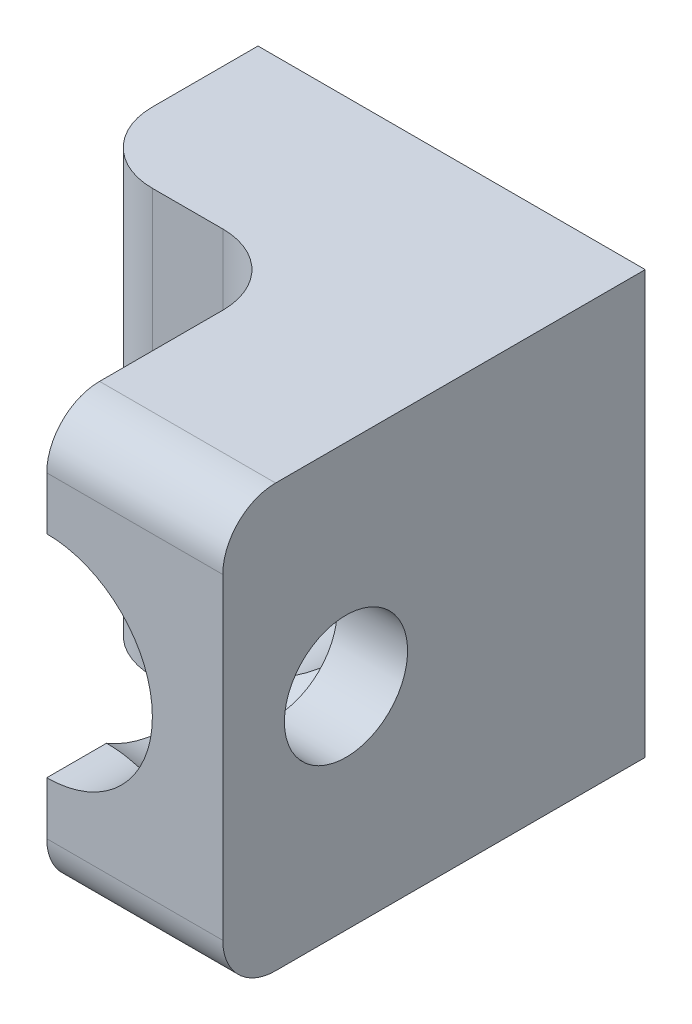
ISO-10303-21;
HEADER;
FILE_DESCRIPTION(('STEP AP214'),'2;1');
FILE_NAME('part.step','',(''),(''),'','','');
FILE_SCHEMA(('AUTOMOTIVE_DESIGN { 1 0 10303 214 1 1 1 1 }'));
ENDSEC;
DATA;
#1=APPLICATION_CONTEXT('core data for automotive mechanical design processes');
#2=APPLICATION_PROTOCOL_DEFINITION('international standard','automotive_design',2000,#1);
#3=PRODUCT_CONTEXT('',#1,'mechanical');
#4=PRODUCT('Part','Part','',(#3));
#5=PRODUCT_RELATED_PRODUCT_CATEGORY('part','',(#4));
#6=PRODUCT_DEFINITION_FORMATION('','',#4);
#7=PRODUCT_DEFINITION_CONTEXT('part definition',#1,'design');
#8=PRODUCT_DEFINITION('design','',#6,#7);
#9=PRODUCT_DEFINITION_SHAPE('','',#8);
#10=(LENGTH_UNIT() NAMED_UNIT(*) SI_UNIT(.MILLI.,.METRE.));
#11=(NAMED_UNIT(*) PLANE_ANGLE_UNIT() SI_UNIT($,.RADIAN.));
#12=(NAMED_UNIT(*) SI_UNIT($,.STERADIAN.) SOLID_ANGLE_UNIT());
#13=UNCERTAINTY_MEASURE_WITH_UNIT(LENGTH_MEASURE(1.E-05),#10,'distance_accuracy_value','');
#14=(GEOMETRIC_REPRESENTATION_CONTEXT(3) GLOBAL_UNCERTAINTY_ASSIGNED_CONTEXT((#13)) GLOBAL_UNIT_ASSIGNED_CONTEXT((#10,
#11,#12)) REPRESENTATION_CONTEXT('',''));
#15=CARTESIAN_POINT('',(0.,0.,0.));
#16=DIRECTION('',(0.,0.,1.));
#17=DIRECTION('',(1.,0.,0.));
#18=AXIS2_PLACEMENT_3D('',#15,#16,#17);
#19=CARTESIAN_POINT('',(0.,0.,5.));
#20=DIRECTION('',(0.,0.,-1.));
#21=DIRECTION('',(-1.,0.,0.));
#22=AXIS2_PLACEMENT_3D('',#19,#20,#21);
#23=CYLINDRICAL_SURFACE('',#22,3.);
#24=CARTESIAN_POINT('',(3.,0.,12.));
#25=CARTESIAN_POINT('',(3.00001633775411,0.0710041835583697,12.0000170022289));
#26=CARTESIAN_POINT('',(2.99747976128876,0.141995694320472,11.9978398644975));
#27=CARTESIAN_POINT('',(2.98742711328492,0.283315653690185,11.9892274963687));
#28=CARTESIAN_POINT('',(2.97991461773743,0.353644541711693,11.982795323896));
#29=CARTESIAN_POINT('',(2.96011400626676,0.492558840544803,11.9658692983622));
#30=CARTESIAN_POINT('',(2.94786376785825,0.561153594120886,11.9554076628753));
#31=CARTESIAN_POINT('',(2.91881454099886,0.696656257307692,11.9306590213712));
#32=CARTESIAN_POINT('',(2.90201496040398,0.763563946089351,11.9163715173803));
#33=CARTESIAN_POINT('',(2.84527703800831,0.960740635150711,11.8682623547826));
#34=CARTESIAN_POINT('',(2.79892714871843,1.08795293552987,11.8291314879743));
#35=CARTESIAN_POINT('',(2.69153719144,1.33171680913301,11.7393690034355));
#36=CARTESIAN_POINT('',(2.63046789263742,1.448246524441,11.6887145126834));
#37=CARTESIAN_POINT('',(2.47045184466388,1.7113429642546,11.5578157443865));
#38=CARTESIAN_POINT('',(2.36591652066644,1.85259055558324,11.4736276809207));
#39=CARTESIAN_POINT('',(2.19499021751385,2.04682837404312,11.3401985238869));
#40=CARTESIAN_POINT('',(2.13555034311233,2.10872346326868,11.2944489838427));
#41=CARTESIAN_POINT('',(2.01225951085483,2.22667426047481,11.2013973194638));
#42=CARTESIAN_POINT('',(1.94841014785883,2.28273206152663,11.1540957596919));
#43=CARTESIAN_POINT('',(1.81518541502242,2.39009915702108,11.0578760942901));
#44=CARTESIAN_POINT('',(1.74572457414769,2.4412898984597,11.0089446253118));
#45=CARTESIAN_POINT('',(1.60244675269493,2.53764058581353,10.9114467445743));
#46=CARTESIAN_POINT('',(1.52862834947803,2.58279854629449,10.8628804579376));
#47=CARTESIAN_POINT('',(1.37661843052713,2.66691965115512,10.7675038527581));
#48=CARTESIAN_POINT('',(1.29843302030285,2.70589116555522,10.7206912282802));
#49=CARTESIAN_POINT('',(1.13734906339909,2.77744410133662,10.6305194486357));
#50=CARTESIAN_POINT('',(1.05445439394846,2.81003068396212,10.5871575210868));
#51=CARTESIAN_POINT('',(0.874598638987153,2.87141676741914,10.5019964034133));
#52=CARTESIAN_POINT('',(0.777071653259997,2.89946856779334,10.4608301304701));
#53=CARTESIAN_POINT('',(0.57601560305952,2.94597031964501,10.390253355229));
#54=CARTESIAN_POINT('',(0.472522678361376,2.96447246663734,10.3607791569805));
#55=CARTESIAN_POINT('',(0.306834908970952,2.98487635994208,10.3277637064125));
#56=CARTESIAN_POINT('',(0.246228042378373,2.99049788569714,10.3185190733684));
#57=CARTESIAN_POINT('',(0.123778706724893,2.99808254680575,10.3059676393636));
#58=CARTESIAN_POINT('',(0.0619307088552813,3.00002117254105,10.3027006245848));
#59=CARTESIAN_POINT('',(0.,3.,10.302775637732));
#60=B_SPLINE_CURVE_WITH_KNOTS('',3,(#24,#25,#26,#27,#28,#29,#30,#31,#32,#33,#34,#35,#36,#37,#38,
#39,#40,#41,#42,#43,#44,#45,#46,#47,#48,#49,#50,#51,#52,#53,#54,#55,#56,#57,#58,#59),
.UNSPECIFIED.,.F.,.F.,(4,2,2,2,2,2,2,2,2,2,2,2,2,2,2,2,2,4),(0.,0.21291321799361,
0.425673589681885,0.636767011782253,0.84788792309536,1.26865257537392,1.69025979710682,
2.27140064229933,2.56294132748464,2.85437711258026,3.15168989736915,3.44910029027378,
3.7461048044053,4.04286823610708,4.37053402174074,4.69638939754148,4.88070391336868,
5.06624079907364),.UNSPECIFIED.);
#61=CARTESIAN_POINT('',(3.,0.,12.));
#62=VERTEX_POINT('',#61);
#63=CARTESIAN_POINT('',(0.,3.,10.302775637732));
#64=VERTEX_POINT('',#63);
#65=EDGE_CURVE('E286',#62,#64,#60,.T.);
#66=ORIENTED_EDGE('',*,*,#65,.F.);
#67=CARTESIAN_POINT('',(0.,0.,12.));
#68=DIRECTION('',(0.,0.,-1.));
#69=DIRECTION('',(1.,0.,0.));
#70=AXIS2_PLACEMENT_3D('',#67,#68,#69);
#71=CIRCLE('',#70,3.);
#72=CARTESIAN_POINT('',(0.,3.,12.));
#73=VERTEX_POINT('',#72);
#74=EDGE_CURVE('E340',#73,#62,#71,.T.);
#75=ORIENTED_EDGE('',*,*,#74,.F.);
#76=DIRECTION('',(0.,0.,-1.));
#77=VECTOR('',#76,1.);
#78=CARTESIAN_POINT('',(0.,3.,12.));
#79=LINE('',#78,#77);
#80=EDGE_CURVE('E342',#73,#64,#79,.T.);
#81=ORIENTED_EDGE('',*,*,#80,.T.);
#82=EDGE_LOOP('',(#66,#75,#81));
#83=FACE_BOUND('',#82,.T.);
#84=ADVANCED_FACE('F36',(#83),#23,.F.);
#85=CARTESIAN_POINT('',(0.,-3.,10.302775637732));
#86=CARTESIAN_POINT('',(0.0509782574028776,-3.00001221469676,10.3027351255346));
#87=CARTESIAN_POINT('',(0.101929503496293,-2.99870116871572,10.3049368888778));
#88=CARTESIAN_POINT('',(0.203244722626997,-2.99353287116003,10.3135063025252));
#89=CARTESIAN_POINT('',(0.253609717217957,-2.9896810615236,10.3198650489301));
#90=CARTESIAN_POINT('',(0.352654909751894,-2.97961065684442,10.3363018828792));
#91=CARTESIAN_POINT('',(0.401349148380551,-2.97343026409919,10.3463198607921));
#92=CARTESIAN_POINT('',(0.497622474635582,-2.9588416466632,10.3696120547244));
#93=CARTESIAN_POINT('',(0.545200866775569,-2.95043207072965,10.3828882453804));
#94=CARTESIAN_POINT('',(0.726157814320993,-2.9139975074394,10.4393441007995));
#95=CARTESIAN_POINT('',(0.85506933756873,-2.87851173420836,10.4923306497304));
#96=CARTESIAN_POINT('',(1.04056910301911,-2.81452738275439,10.5808183598738));
#97=CARTESIAN_POINT('',(1.10137237396703,-2.79126425540245,10.611992739488));
#98=CARTESIAN_POINT('',(1.22040935784467,-2.74130563551504,10.6764417547228));
#99=CARTESIAN_POINT('',(1.27864396134847,-2.71461134535184,10.7097156525458));
#100=CARTESIAN_POINT('',(1.4222275235347,-2.6432232929282,10.7951850848155));
#101=CARTESIAN_POINT('',(1.50598538452611,-2.59637160280961,10.8482488825418));
#102=CARTESIAN_POINT('',(1.66820661712296,-2.49523964907324,10.9554470787355));
#103=CARTESIAN_POINT('',(1.74666740599088,-2.44095580019921,11.0095819830539));
#104=CARTESIAN_POINT('',(1.89808768116394,-2.32514957383405,11.1172337547621));
#105=CARTESIAN_POINT('',(1.97106129394351,-2.2636469062519,11.1707518862159));
#106=CARTESIAN_POINT('',(2.11148804783259,-2.13326006036693,11.276009457029));
#107=CARTESIAN_POINT('',(2.17894066420241,-2.06437518185999,11.3277487270472));
#108=CARTESIAN_POINT('',(2.34361912431401,-1.87889158232084,11.4561109770901));
#109=CARTESIAN_POINT('',(2.43664287715046,-1.75699755578858,11.5306441279723));
#110=CARTESIAN_POINT('',(2.60520555605571,-1.49565744692714,11.6677617616793));
#111=CARTESIAN_POINT('',(2.68076628257079,-1.35623358804076,11.7303611250795));
#112=CARTESIAN_POINT('',(2.79874727634433,-1.08830536541844,11.8289852260442));
#113=CARTESIAN_POINT('',(2.84468813430475,-0.962376032465356,11.8677675367341));
#114=CARTESIAN_POINT('',(2.91975024600053,-0.702331299892864,11.9314051965436));
#115=CARTESIAN_POINT('',(2.94890505699959,-0.568232829315052,11.9562883287469));
#116=CARTESIAN_POINT('',(2.97909960785513,-0.360774253811003,11.9820983229808));
#117=CARTESIAN_POINT('',(2.9869169852851,-0.289032304751515,11.9887909130479));
#118=CARTESIAN_POINT('',(2.99737282014752,-0.144874980211614,11.9977478922567));
#119=CARTESIAN_POINT('',(3.00000954791344,-0.0724593879264361,12.0000108024577));
#120=CARTESIAN_POINT('',(3.,0.,12.));
#121=B_SPLINE_CURVE_WITH_KNOTS('',3,(#85,#86,#87,#88,#89,#90,#91,#92,#93,#94,#95,#96,#97,#98,
#99,#100,#101,#102,#103,#104,#105,#106,#107,#108,#109,#110,#111,#112,#113,#114,#115,#116,#117,
#118,#119,#120),.UNSPECIFIED.,.F.,.F.,(4,2,2,2,2,2,2,2,2,2,2,2,2,2,2,2,2,4),(0.,
0.152826890262725,0.305327506300242,0.455428080226498,0.605619848079139,1.03426477733012,
1.25074248677913,1.46714454235019,1.79571182905145,2.12443817800805,2.45228699993933,
2.78016694596265,3.28964987352476,3.79849329654633,4.21544485065856,4.63155994969172,
4.8486996419294,5.0659118184119),.UNSPECIFIED.);
#122=CARTESIAN_POINT('',(0.,-3.,10.302775637732));
#123=VERTEX_POINT('',#122);
#124=EDGE_CURVE('E280',#123,#62,#121,.T.);
#125=ORIENTED_EDGE('',*,*,#124,.F.);
#126=DIRECTION('',(0.,0.,-1.));
#127=VECTOR('',#126,1.);
#128=CARTESIAN_POINT('',(0.,-3.,12.));
#129=LINE('',#128,#127);
#130=CARTESIAN_POINT('',(0.,-3.,12.));
#131=VERTEX_POINT('',#130);
#132=EDGE_CURVE('E351',#131,#123,#129,.T.);
#133=ORIENTED_EDGE('',*,*,#132,.F.);
#134=EDGE_CURVE('E349',#62,#131,#71,.T.);
#135=ORIENTED_EDGE('',*,*,#134,.F.);
#136=EDGE_LOOP('',(#125,#133,#135));
#137=FACE_BOUND('',#136,.T.);
#138=ADVANCED_FACE('F264',(#137),#23,.F.);
#139=CARTESIAN_POINT('',(7.,0.,8.5));
#140=DIRECTION('',(-1.,0.,0.));
#141=DIRECTION('',(0.,0.,1.));
#142=AXIS2_PLACEMENT_3D('',#139,#140,#141);
#143=CYLINDRICAL_SURFACE('',#142,1.75);
#144=CARTESIAN_POINT('',(5.,0.,8.5));
#145=DIRECTION('',(-1.,0.,0.));
#146=DIRECTION('',(0.,0.,1.));
#147=AXIS2_PLACEMENT_3D('',#144,#145,#146);
#148=CIRCLE('',#147,1.75);
#149=CARTESIAN_POINT('',(5.,0.,10.25));
#150=VERTEX_POINT('',#149);
#151=EDGE_CURVE('E386',#150,#150,#148,.F.);
#152=ORIENTED_EDGE('',*,*,#151,.T.);
#153=EDGE_LOOP('',(#152));
#154=FACE_BOUND('',#153,.T.);
#155=CARTESIAN_POINT('',(3.,0.,8.5));
#156=DIRECTION('',(-1.,0.,0.));
#157=DIRECTION('',(0.,0.,1.));
#158=AXIS2_PLACEMENT_3D('',#155,#156,#157);
#159=CIRCLE('',#158,1.75);
#160=CARTESIAN_POINT('',(3.,0.,10.25));
#161=VERTEX_POINT('',#160);
#162=EDGE_CURVE('E218',#161,#161,#159,.F.);
#163=ORIENTED_EDGE('',*,*,#162,.F.);
#164=EDGE_LOOP('',(#163));
#165=FACE_BOUND('',#164,.T.);
#166=ADVANCED_FACE('F300',(#154,#165),#143,.F.);
#167=CARTESIAN_POINT('',(0.,0.,5.));
#168=DIRECTION('',(0.,0.,-1.));
#169=DIRECTION('',(-1.,0.,0.));
#170=AXIS2_PLACEMENT_3D('',#167,#168,#169);
#171=PLANE('',#170);
#172=DIRECTION('',(-1.,0.,0.));
#173=VECTOR('',#172,1.);
#174=CARTESIAN_POINT('',(-6.,6.,5.));
#175=LINE('',#174,#173);
#176=CARTESIAN_POINT('',(-2.,6.,5.));
#177=VERTEX_POINT('',#176);
#178=CARTESIAN_POINT('',(-4.,6.,5.));
#179=VERTEX_POINT('',#178);
#180=EDGE_CURVE('E193',#177,#179,#175,.T.);
#181=ORIENTED_EDGE('',*,*,#180,.T.);
#182=DIRECTION('',(0.,-1.,0.));
#183=VECTOR('',#182,1.);
#184=CARTESIAN_POINT('',(-4.,0.,5.));
#185=LINE('',#184,#183);
#186=CARTESIAN_POINT('',(-4.,-6.,5.));
#187=VERTEX_POINT('',#186);
#188=EDGE_CURVE('E183',#179,#187,#185,.T.);
#189=ORIENTED_EDGE('',*,*,#188,.T.);
#190=DIRECTION('',(1.,0.,0.));
#191=VECTOR('',#190,1.);
#192=CARTESIAN_POINT('',(-6.,-6.,5.));
#193=LINE('',#192,#191);
#194=CARTESIAN_POINT('',(-2.,-6.,5.));
#195=VERTEX_POINT('',#194);
#196=EDGE_CURVE('E204',#187,#195,#193,.T.);
#197=ORIENTED_EDGE('',*,*,#196,.T.);
#198=DIRECTION('',(0.,-1.,0.));
#199=VECTOR('',#198,1.);
#200=CARTESIAN_POINT('',(-2.,-3.,5.));
#201=LINE('',#200,#199);
#202=CARTESIAN_POINT('',(-2.,-2.23606797749979,5.));
#203=VERTEX_POINT('',#202);
#204=EDGE_CURVE('E230',#195,#203,#201,.F.);
#205=ORIENTED_EDGE('',*,*,#204,.T.);
#206=CARTESIAN_POINT('',(0.,0.,5.));
#207=DIRECTION('',(0.,0.,1.));
#208=DIRECTION('',(1.,0.,0.));
#209=AXIS2_PLACEMENT_3D('',#206,#207,#208);
#210=CIRCLE('',#209,3.);
#211=CARTESIAN_POINT('',(-2.,2.23606797749979,5.));
#212=VERTEX_POINT('',#211);
#213=EDGE_CURVE('E365',#212,#203,#210,.T.);
#214=ORIENTED_EDGE('',*,*,#213,.F.);
#215=DIRECTION('',(0.,-1.,0.));
#216=VECTOR('',#215,1.);
#217=CARTESIAN_POINT('',(-2.,6.,5.));
#218=LINE('',#217,#216);
#219=EDGE_CURVE('E203',#212,#177,#218,.F.);
#220=ORIENTED_EDGE('',*,*,#219,.T.);
#221=EDGE_LOOP('',(#181,#189,#197,#205,#214,#220));
#222=FACE_BOUND('',#221,.T.);
#223=ADVANCED_FACE('F199',(#222),#171,.F.);
#224=CARTESIAN_POINT('',(0.,0.,0.));
#225=DIRECTION('',(0.,0.,-1.));
#226=DIRECTION('',(-1.,0.,0.));
#227=AXIS2_PLACEMENT_3D('',#224,#225,#226);
#228=PLANE('',#227);
#229=DIRECTION('',(0.,1.,0.));
#230=VECTOR('',#229,1.);
#231=CARTESIAN_POINT('',(5.,0.,0.));
#232=LINE('',#231,#230);
#233=CARTESIAN_POINT('',(5.,-6.,0.));
#234=VERTEX_POINT('',#233);
#235=CARTESIAN_POINT('',(5.,6.,0.));
#236=VERTEX_POINT('',#235);
#237=EDGE_CURVE('E379',#234,#236,#232,.T.);
#238=ORIENTED_EDGE('',*,*,#237,.F.);
#239=DIRECTION('',(1.,0.,0.));
#240=VECTOR('',#239,1.);
#241=CARTESIAN_POINT('',(-6.,-6.,0.));
#242=LINE('',#241,#240);
#243=CARTESIAN_POINT('',(-6.,-6.,0.));
#244=VERTEX_POINT('',#243);
#245=EDGE_CURVE('E205',#244,#234,#242,.T.);
#246=ORIENTED_EDGE('',*,*,#245,.F.);
#247=DIRECTION('',(0.,-1.,0.));
#248=VECTOR('',#247,1.);
#249=CARTESIAN_POINT('',(-6.,-6.,0.));
#250=LINE('',#249,#248);
#251=CARTESIAN_POINT('',(-6.,6.,0.));
#252=VERTEX_POINT('',#251);
#253=EDGE_CURVE('E215',#252,#244,#250,.T.);
#254=ORIENTED_EDGE('',*,*,#253,.F.);
#255=DIRECTION('',(-1.,0.,0.));
#256=VECTOR('',#255,1.);
#257=CARTESIAN_POINT('',(-6.,6.,0.));
#258=LINE('',#257,#256);
#259=EDGE_CURVE('E368',#236,#252,#258,.T.);
#260=ORIENTED_EDGE('',*,*,#259,.F.);
#261=EDGE_LOOP('',(#238,#246,#254,#260));
#262=FACE_BOUND('',#261,.T.);
#263=CARTESIAN_POINT('',(0.,0.,0.));
#264=DIRECTION('',(0.,0.,1.));
#265=DIRECTION('',(1.,0.,0.));
#266=AXIS2_PLACEMENT_3D('',#263,#264,#265);
#267=CIRCLE('',#266,3.);
#268=CARTESIAN_POINT('',(3.,0.,0.));
#269=VERTEX_POINT('',#268);
#270=EDGE_CURVE('E364',#269,#269,#267,.T.);
#271=ORIENTED_EDGE('',*,*,#270,.T.);
#272=EDGE_LOOP('',(#271));
#273=FACE_BOUND('',#272,.T.);
#274=ADVANCED_FACE('F376',(#262,#273),#228,.T.);
#275=CARTESIAN_POINT('',(-6.,6.,5.));
#276=DIRECTION('',(0.,-1.,0.));
#277=DIRECTION('',(0.,0.,-1.));
#278=AXIS2_PLACEMENT_3D('',#275,#276,#277);
#279=PLANE('',#278);
#280=DIRECTION('',(-1.,0.,0.));
#281=VECTOR('',#280,1.);
#282=CARTESIAN_POINT('',(6.,6.,10.5));
#283=LINE('',#282,#281);
#284=CARTESIAN_POINT('',(0.,6.,10.5));
#285=VERTEX_POINT('',#284);
#286=CARTESIAN_POINT('',(5.,6.,10.5));
#287=VERTEX_POINT('',#286);
#288=EDGE_CURVE('E181',#285,#287,#283,.F.);
#289=ORIENTED_EDGE('',*,*,#288,.T.);
#290=DIRECTION('',(0.,0.,-1.));
#291=VECTOR('',#290,1.);
#292=CARTESIAN_POINT('',(5.,6.,5.));
#293=LINE('',#292,#291);
#294=EDGE_CURVE('E50',#287,#236,#293,.T.);
#295=ORIENTED_EDGE('',*,*,#294,.T.);
#296=ORIENTED_EDGE('',*,*,#259,.T.);
#297=DIRECTION('',(0.,0.,-1.));
#298=VECTOR('',#297,1.);
#299=CARTESIAN_POINT('',(-6.,6.,5.));
#300=LINE('',#299,#298);
#301=CARTESIAN_POINT('',(-6.,6.,3.));
#302=VERTEX_POINT('',#301);
#303=EDGE_CURVE('E195',#302,#252,#300,.T.);
#304=ORIENTED_EDGE('',*,*,#303,.F.);
#305=CARTESIAN_POINT('',(-4.,6.,3.));
#306=DIRECTION('',(0.,-1.,0.));
#307=DIRECTION('',(0.,0.,-1.));
#308=AXIS2_PLACEMENT_3D('',#305,#306,#307);
#309=CIRCLE('',#308,2.);
#310=EDGE_CURVE('E44',#302,#179,#309,.F.);
#311=ORIENTED_EDGE('',*,*,#310,.T.);
#312=ORIENTED_EDGE('',*,*,#180,.F.);
#313=CARTESIAN_POINT('',(-2.,6.,7.));
#314=DIRECTION('',(0.,-1.,0.));
#315=DIRECTION('',(0.,0.,-1.));
#316=AXIS2_PLACEMENT_3D('',#313,#314,#315);
#317=CIRCLE('',#316,2.);
#318=CARTESIAN_POINT('',(0.,6.,7.));
#319=VERTEX_POINT('',#318);
#320=EDGE_CURVE('E168',#177,#319,#317,.T.);
#321=ORIENTED_EDGE('',*,*,#320,.T.);
#322=DIRECTION('',(0.,0.,-1.));
#323=VECTOR('',#322,1.);
#324=CARTESIAN_POINT('',(0.,6.,12.));
#325=LINE('',#324,#323);
#326=EDGE_CURVE('E362',#285,#319,#325,.T.);
#327=ORIENTED_EDGE('',*,*,#326,.F.);
#328=EDGE_LOOP('',(#289,#295,#296,#304,#311,#312,#321,#327));
#329=FACE_BOUND('',#328,.T.);
#330=ADVANCED_FACE('F192',(#329),#279,.F.);
#331=CARTESIAN_POINT('',(-6.,-6.,5.));
#332=DIRECTION('',(1.,0.,0.));
#333=DIRECTION('',(0.,0.,-1.));
#334=AXIS2_PLACEMENT_3D('',#331,#332,#333);
#335=PLANE('',#334);
#336=DIRECTION('',(0.,0.,-1.));
#337=VECTOR('',#336,1.);
#338=CARTESIAN_POINT('',(-6.,-6.,5.));
#339=LINE('',#338,#337);
#340=CARTESIAN_POINT('',(-6.,-6.,3.));
#341=VERTEX_POINT('',#340);
#342=EDGE_CURVE('E210',#341,#244,#339,.T.);
#343=ORIENTED_EDGE('',*,*,#342,.F.);
#344=DIRECTION('',(0.,-1.,0.));
#345=VECTOR('',#344,1.);
#346=CARTESIAN_POINT('',(-6.,-6.,3.));
#347=LINE('',#346,#345);
#348=EDGE_CURVE('E58',#341,#302,#347,.F.);
#349=ORIENTED_EDGE('',*,*,#348,.T.);
#350=ORIENTED_EDGE('',*,*,#303,.T.);
#351=ORIENTED_EDGE('',*,*,#253,.T.);
#352=EDGE_LOOP('',(#343,#349,#350,#351));
#353=FACE_BOUND('',#352,.T.);
#354=ADVANCED_FACE('F213',(#353),#335,.F.);
#355=CARTESIAN_POINT('',(-6.,-6.,5.));
#356=DIRECTION('',(0.,1.,0.));
#357=DIRECTION('',(0.,0.,1.));
#358=AXIS2_PLACEMENT_3D('',#355,#356,#357);
#359=PLANE('',#358);
#360=ORIENTED_EDGE('',*,*,#245,.T.);
#361=DIRECTION('',(0.,0.,1.));
#362=VECTOR('',#361,1.);
#363=CARTESIAN_POINT('',(5.,-6.,5.));
#364=LINE('',#363,#362);
#365=CARTESIAN_POINT('',(5.,-6.,10.5));
#366=VERTEX_POINT('',#365);
#367=EDGE_CURVE('E372',#234,#366,#364,.T.);
#368=ORIENTED_EDGE('',*,*,#367,.T.);
#369=DIRECTION('',(1.,0.,0.));
#370=VECTOR('',#369,1.);
#371=CARTESIAN_POINT('',(0.,-6.,10.5));
#372=LINE('',#371,#370);
#373=CARTESIAN_POINT('',(0.,-6.,10.5));
#374=VERTEX_POINT('',#373);
#375=EDGE_CURVE('E170',#366,#374,#372,.F.);
#376=ORIENTED_EDGE('',*,*,#375,.T.);
#377=DIRECTION('',(0.,0.,-1.));
#378=VECTOR('',#377,1.);
#379=CARTESIAN_POINT('',(0.,-6.,12.));
#380=LINE('',#379,#378);
#381=CARTESIAN_POINT('',(0.,-6.,7.));
#382=VERTEX_POINT('',#381);
#383=EDGE_CURVE('E356',#374,#382,#380,.T.);
#384=ORIENTED_EDGE('',*,*,#383,.T.);
#385=CARTESIAN_POINT('',(-2.,-6.,7.));
#386=DIRECTION('',(0.,1.,0.));
#387=DIRECTION('',(0.,0.,1.));
#388=AXIS2_PLACEMENT_3D('',#385,#386,#387);
#389=CIRCLE('',#388,2.);
#390=EDGE_CURVE('E235',#382,#195,#389,.T.);
#391=ORIENTED_EDGE('',*,*,#390,.T.);
#392=ORIENTED_EDGE('',*,*,#196,.F.);
#393=CARTESIAN_POINT('',(-4.,-6.,3.));
#394=DIRECTION('',(0.,1.,0.));
#395=DIRECTION('',(0.,0.,1.));
#396=AXIS2_PLACEMENT_3D('',#393,#394,#395);
#397=CIRCLE('',#396,2.);
#398=EDGE_CURVE('E186',#187,#341,#397,.F.);
#399=ORIENTED_EDGE('',*,*,#398,.T.);
#400=ORIENTED_EDGE('',*,*,#342,.T.);
#401=EDGE_LOOP('',(#360,#368,#376,#384,#391,#392,#399,#400));
#402=FACE_BOUND('',#401,.T.);
#403=ADVANCED_FACE('F209',(#402),#359,.F.);
#404=CARTESIAN_POINT('',(-0.0230737294633878,2.99991126585582,6.69707670795695));
#405=CARTESIAN_POINT('',(-0.0153843795169809,2.99997087007047,6.69717643707883));
#406=CARTESIAN_POINT('',(-0.00769282256145781,3.00000040313485,6.69722551150542));
#407=CARTESIAN_POINT('',(0.10063549880719,2.99999472629503,6.69720932824374));
#408=CARTESIAN_POINT('',(0.201487583164763,2.99486641388753,6.68859942308694));
#409=CARTESIAN_POINT('',(0.399839573848178,2.97492474213119,6.65604925814195));
#410=CARTESIAN_POINT('',(0.497323023414701,2.96006942644155,6.63204259540447));
#411=CARTESIAN_POINT('',(0.726645476284945,2.91390293932926,6.56051273153155));
#412=CARTESIAN_POINT('',(0.855801981851916,2.87830790913942,6.50735339701527));
#413=CARTESIAN_POINT('',(1.10350180249017,2.79277040442307,6.38912727472004));
#414=CARTESIAN_POINT('',(1.22200978271816,2.74278232077096,6.32402287681685));
#415=CARTESIAN_POINT('',(1.42216604613675,2.64324386445891,6.20483132775373));
#416=CARTESIAN_POINT('',(1.50585779438779,2.59644034342337,6.15182653710108));
#417=CARTESIAN_POINT('',(1.66796036206272,2.49540395165848,6.04472452603639));
#418=CARTESIAN_POINT('',(1.74636855348223,2.44116742390157,5.99062677913148));
#419=CARTESIAN_POINT('',(1.89780620255098,2.32538168143483,5.88297003484143));
#420=CARTESIAN_POINT('',(1.97084172301502,2.26384092081247,5.82941049095632));
#421=CARTESIAN_POINT('',(2.11138446431836,2.13336607417736,5.72407037785019));
#422=CARTESIAN_POINT('',(2.17889115838323,2.06443128511967,5.67228997841434));
#423=CARTESIAN_POINT('',(2.34364163007682,1.87886570057397,5.5438712984986));
#424=CARTESIAN_POINT('',(2.43668464524049,1.75694066452054,5.46932239858382));
#425=CARTESIAN_POINT('',(2.60523936624697,1.49559719363083,5.33221023628814));
#426=CARTESIAN_POINT('',(2.68078063176448,1.35620887629967,5.26962679649817));
#427=CARTESIAN_POINT('',(2.79870963677905,1.08838439347991,5.17104630644035));
#428=CARTESIAN_POINT('',(2.84462329256295,0.962531950329886,5.13228745941746));
#429=CARTESIAN_POINT('',(2.91970789166954,0.702546439275339,5.06863069055931));
#430=CARTESIAN_POINT('',(2.94888862290766,0.568418263222594,5.04372466577953));
#431=CARTESIAN_POINT('',(2.98869764952521,0.294755847206142,5.00969842701452));
#432=CARTESIAN_POINT('',(2.99923731893052,0.155198989053823,5.00065362441621));
#433=CARTESIAN_POINT('',(3.00068202783879,-0.124088953319473,4.99941550678962));
#434=CARTESIAN_POINT('',(2.99158926410074,-0.263820016299423,5.00722030638549));
#435=CARTESIAN_POINT('',(2.95592074199308,-0.52816089070616,5.03771864901288));
#436=CARTESIAN_POINT('',(2.93074650275624,-0.653106092018457,5.05921827623044));
#437=CARTESIAN_POINT('',(2.86575832223097,-0.896258880688086,5.11440141013123));
#438=CARTESIAN_POINT('',(2.82594194616292,-1.01446534371084,5.14808694314251));
#439=CARTESIAN_POINT('',(2.72999895669153,-1.25084032651165,5.22858497993864));
#440=CARTESIAN_POINT('',(2.67286024475861,-1.36831880303658,5.27620251693447));
#441=CARTESIAN_POINT('',(2.54606988957381,-1.59187853762999,5.38051507031666));
#442=CARTESIAN_POINT('',(2.47640921148819,-1.69795147748706,5.43721663776774));
#443=CARTESIAN_POINT('',(2.28869859556029,-1.94865287053365,5.58736084236892));
#444=CARTESIAN_POINT('',(2.16392970624293,-2.08584969860487,5.68494191152829));
#445=CARTESIAN_POINT('',(1.96192597376954,-2.2713969111576,5.83594808786853));
#446=CARTESIAN_POINT('',(1.89198829101292,-2.32995130174331,5.88714444499352));
#447=CARTESIAN_POINT('',(1.74729226758945,-2.44033558939616,5.98993031844844));
#448=CARTESIAN_POINT('',(1.67253539928371,-2.49216752587252,6.04151971049017));
#449=CARTESIAN_POINT('',(1.47309098170778,-2.6174221692577,6.17374186665338));
#450=CARTESIAN_POINT('',(1.34471453757427,-2.68580303414392,6.25376251340855));
#451=CARTESIAN_POINT('',(1.14241973378804,-2.77493584120478,6.36644629744879));
#452=CARTESIAN_POINT('',(1.07342650559848,-2.8023901451444,6.40275647187609));
#453=CARTESIAN_POINT('',(0.931919761210453,-2.85257107040049,6.47154193087967));
#454=CARTESIAN_POINT('',(0.859408557112779,-2.87530074630553,6.50401968729927));
#455=CARTESIAN_POINT('',(0.693073557323317,-2.92039866244156,6.57043082267293));
#456=CARTESIAN_POINT('',(0.598265190799725,-2.94140997945973,6.60289174999206));
#457=CARTESIAN_POINT('',(0.403829910888348,-2.97431533356735,6.65489049353079));
#458=CARTESIAN_POINT('',(0.304223386965683,-2.98624485817507,6.67447856951278));
#459=CARTESIAN_POINT('',(0.135920262881732,-2.99768270709518,6.69335430913964));
#460=CARTESIAN_POINT('',(0.0679320669215239,-2.99999885887046,6.69722086501818));
#461=CARTESIAN_POINT('',(-0.0076922666327115,-3.00000012921545,6.69722475827801));
#462=CARTESIAN_POINT('',(-0.0153838135735382,-2.99997057514371,6.697175621782));
#463=CARTESIAN_POINT('',(-0.0230737294633878,-2.99991126585582,6.69707670795695));
#464=B_SPLINE_CURVE_WITH_KNOTS('',3,(#404,#405,#406,#407,#408,#409,#410,#411,#412,#413,#414,
#415,#416,#417,#418,#419,#420,#421,#422,#423,#424,#425,#426,#427,#428,#429,#430,#431,#432,#433,
#434,#435,#436,#437,#438,#439,#440,#441,#442,#443,#444,#445,#446,#447,#448,#449,#450,#451,#452,
#453,#454,#455,#456,#457,#458,#459,#460,#461,#462,#463),.UNSPECIFIED.,.F.,.F.,(4,2,2,2,2,2,2,2,
2,2,2,2,2,2,2,2,2,2,2,2,2,2,2,2,2,2,2,2,2,4),(0.,0.0230743725135382,0.324927296978078,
0.628090884088798,1.05804383769047,1.48937452252208,1.8176890019747,2.14616559543208,
2.47426564347554,2.80239691589166,3.31199365638033,3.8207233321967,4.2373785879417,
4.65378987213746,5.07217564924437,5.49051461375909,5.87661007483207,6.26276976715473,
6.67837179124771,7.09427489249696,7.71930180582808,8.03285421329348,8.34631127389315,
8.84261185225973,9.09035943783789,9.33794634683784,9.64409027257232,9.94903169813204,
10.1528064621393,10.1758808346529),.UNSPECIFIED.);
#465=CARTESIAN_POINT('',(-0.0230737294633878,2.99991126585582,6.69707670795695));
#466=VERTEX_POINT('',#465);
#467=CARTESIAN_POINT('',(3.,0.,5.));
#468=VERTEX_POINT('',#467);
#469=EDGE_CURVE('E410',#466,#468,#464,.T.);
#470=ORIENTED_EDGE('',*,*,#469,.F.);
#471=CARTESIAN_POINT('',(-0.0230737294633878,2.99991126585582,6.69707670795695));
#472=CARTESIAN_POINT('',(-0.031456910503074,2.99983684420899,6.64233300031767));
#473=CARTESIAN_POINT('',(-0.042123742919575,2.99972937596303,6.58794115769204));
#474=CARTESIAN_POINT('',(-0.0679290063160397,2.99926123917261,6.4802271054641));
#475=CARTESIAN_POINT('',(-0.0830676549282547,2.99890055830373,6.42690494805563));
#476=CARTESIAN_POINT('',(-0.117744551519876,2.99773803729938,6.32162706821907));
#477=CARTESIAN_POINT('',(-0.137289000482698,2.99693557305358,6.26967338810088));
#478=CARTESIAN_POINT('',(-0.180609360457961,2.99463689441683,6.16759582276077));
#479=CARTESIAN_POINT('',(-0.204385135963736,2.9931407022398,6.11747187900417));
#480=CARTESIAN_POINT('',(-0.281894618430344,2.98717846497126,5.97024665030054));
#481=CARTESIAN_POINT('',(-0.341793491043421,2.98123878226447,5.87634339136789));
#482=CARTESIAN_POINT('',(-0.47588260579657,2.96278391735563,5.70026754016476));
#483=CARTESIAN_POINT('',(-0.550057596153536,2.9502757281365,5.61808259040261));
#484=CARTESIAN_POINT('',(-0.706929997388213,2.91657964674665,5.47057766566407));
#485=CARTESIAN_POINT('',(-0.789226025958239,2.8957193589683,5.40475829354039));
#486=CARTESIAN_POINT('',(-0.960718262011074,2.84341777400023,5.28809046890964));
#487=CARTESIAN_POINT('',(-1.04990945759784,2.81198410762178,5.23723126911924));
#488=CARTESIAN_POINT('',(-1.22496783340231,2.74004015277211,5.1538918678677));
#489=CARTESIAN_POINT('',(-1.31067017134709,2.70025910362301,5.12042616299266));
#490=CARTESIAN_POINT('',(-1.481033048263,2.61071002951155,5.06643616499974));
#491=CARTESIAN_POINT('',(-1.565692272725,2.56093054738998,5.04592683132182));
#492=CARTESIAN_POINT('',(-1.70981339631196,2.46616516820891,5.02017452005147));
#493=CARTESIAN_POINT('',(-1.77018827553004,2.4232022539228,5.01237027747852));
#494=CARTESIAN_POINT('',(-1.88766594931985,2.33285727824384,5.00228954987831));
#495=CARTESIAN_POINT('',(-1.94478038221469,2.28549275866799,4.99999202383686));
#496=CARTESIAN_POINT('',(-2.,2.23606797749979,5.));
#497=B_SPLINE_CURVE_WITH_KNOTS('',3,(#471,#472,#473,#474,#475,#476,#477,#478,#479,#480,#481,
#482,#483,#484,#485,#486,#487,#488,#489,#490,#491,#492,#493,#494,#495,#496),.UNSPECIFIED.,.F.,
.F.,(4,2,2,2,2,2,2,2,2,2,2,2,4),(0.,0.166094181596638,0.332196447919101,0.498533972412459,
0.664866170966393,0.997690987307387,1.33016218691188,1.65070175352846,1.9710104811939,
2.27034233038757,2.5700191598105,2.79315575894505,3.01543839038303),.UNSPECIFIED.);
#498=EDGE_CURVE('E173',#466,#212,#497,.T.);
#499=ORIENTED_EDGE('',*,*,#498,.T.);
#500=ORIENTED_EDGE('',*,*,#213,.T.);
#501=CARTESIAN_POINT('',(-2.,-2.23606797749979,5.));
#502=CARTESIAN_POINT('',(-1.95884932025487,-2.27288528310076,4.99999753556133));
#503=CARTESIAN_POINT('',(-1.91665843399448,-2.30856565861895,5.00127057274947));
#504=CARTESIAN_POINT('',(-1.83045586539564,-2.37749178961068,5.00673132709964));
#505=CARTESIAN_POINT('',(-1.78644260702812,-2.41073536583328,5.01092161886935));
#506=CARTESIAN_POINT('',(-1.69677694704611,-2.47466958862093,5.02260160974854));
#507=CARTESIAN_POINT('',(-1.65111949404888,-2.50535119769659,5.03010244689379));
#508=CARTESIAN_POINT('',(-1.55874976465585,-2.5638439392963,5.04871234844466));
#509=CARTESIAN_POINT('',(-1.51203780638183,-2.59165592378557,5.05982033783449));
#510=CARTESIAN_POINT('',(-1.37042098108278,-2.67088441972466,5.09915197177503));
#511=CARTESIAN_POINT('',(-1.27449315968381,-2.71776978193348,5.13333105105718));
#512=CARTESIAN_POINT('',(-1.08510849627501,-2.79877623323238,5.21850593566303));
#513=CARTESIAN_POINT('',(-0.991645653548708,-2.83293162603146,5.26945583936722));
#514=CARTESIAN_POINT('',(-0.820315569467139,-2.88693473417599,5.38202400109305));
#515=CARTESIAN_POINT('',(-0.741809442723524,-2.9078304610522,5.442176640787));
#516=CARTESIAN_POINT('',(-0.593623778948709,-2.94166679433946,5.574522519947));
#517=CARTESIAN_POINT('',(-0.523953632336802,-2.95459899285791,5.64672838335422));
#518=CARTESIAN_POINT('',(-0.395309165449318,-2.97456254703467,5.80198578254568));
#519=CARTESIAN_POINT('',(-0.336444940290156,-2.98153555479295,5.88513556309327));
#520=CARTESIAN_POINT('',(-0.231973545842054,-2.99147879496841,6.05956681501594));
#521=CARTESIAN_POINT('',(-0.186362942384749,-2.99445006500921,6.15084617189961));
#522=CARTESIAN_POINT('',(-0.118368572133767,-2.99781237714847,6.31764080988243));
#523=CARTESIAN_POINT('',(-0.093057134638543,-2.99863878463768,6.39197266237817));
#524=CARTESIAN_POINT('',(-0.0513372223869712,-2.99962349947794,6.54298973652473));
#525=CARTESIAN_POINT('',(-0.0349166693459623,-2.99978271520338,6.61967161517056));
#526=CARTESIAN_POINT('',(-0.0230737294633875,-2.99991126585582,6.69707670795695));
#527=B_SPLINE_CURVE_WITH_KNOTS('',3,(#501,#502,#503,#504,#505,#506,#507,#508,#509,#510,#511,
#512,#513,#514,#515,#516,#517,#518,#519,#520,#521,#522,#523,#524,#525,#526),.UNSPECIFIED.,.F.,
.F.,(4,2,2,2,2,2,2,2,2,2,2,2,4),(0.,0.165639139746022,0.331424649063055,0.497772232083272,
0.664070285058053,0.998333027109149,1.33168839785299,1.63350124047166,1.935632193156,
2.24068855752285,2.54566580759103,2.7807257952244,3.01546564703348),.UNSPECIFIED.);
#528=CARTESIAN_POINT('',(-0.0230737294633878,-2.99991126585582,6.69707670795695));
#529=VERTEX_POINT('',#528);
#530=EDGE_CURVE('E237',#203,#529,#527,.T.);
#531=ORIENTED_EDGE('',*,*,#530,.T.);
#532=EDGE_CURVE('E270',#468,#529,#464,.T.);
#533=ORIENTED_EDGE('',*,*,#532,.F.);
#534=EDGE_LOOP('',(#470,#499,#500,#531,#533));
#535=FACE_BOUND('',#534,.T.);
#536=ORIENTED_EDGE('',*,*,#270,.F.);
#537=EDGE_LOOP('',(#536));
#538=FACE_BOUND('',#537,.T.);
#539=ADVANCED_FACE('F257',(#535,#538),#23,.F.);
#540=CARTESIAN_POINT('',(0.,3.,12.));
#541=DIRECTION('',(1.,0.,0.));
#542=DIRECTION('',(0.,1.,0.));
#543=AXIS2_PLACEMENT_3D('',#540,#541,#542);
#544=PLANE('',#543);
#545=DIRECTION('',(0.,-1.,0.));
#546=VECTOR('',#545,1.);
#547=CARTESIAN_POINT('',(0.,3.,12.));
#548=LINE('',#547,#546);
#549=CARTESIAN_POINT('',(0.,4.5,12.));
#550=VERTEX_POINT('',#549);
#551=EDGE_CURVE('E353',#550,#73,#548,.T.);
#552=ORIENTED_EDGE('',*,*,#551,.F.);
#553=CARTESIAN_POINT('',(0.,4.5,10.5));
#554=DIRECTION('',(1.,0.,0.));
#555=DIRECTION('',(0.,1.,0.));
#556=AXIS2_PLACEMENT_3D('',#553,#554,#555);
#557=CIRCLE('',#556,1.5);
#558=EDGE_CURVE('E166',#550,#285,#557,.F.);
#559=ORIENTED_EDGE('',*,*,#558,.T.);
#560=ORIENTED_EDGE('',*,*,#326,.T.);
#561=DIRECTION('',(0.,-1.,0.));
#562=VECTOR('',#561,1.);
#563=CARTESIAN_POINT('',(0.,3.,7.));
#564=LINE('',#563,#562);
#565=CARTESIAN_POINT('',(0.,3.16227766016838,7.));
#566=VERTEX_POINT('',#565);
#567=EDGE_CURVE('E232',#319,#566,#564,.T.);
#568=ORIENTED_EDGE('',*,*,#567,.T.);
#569=CARTESIAN_POINT('',(0.,0.,8.5));
#570=DIRECTION('',(-1.,0.,0.));
#571=DIRECTION('',(0.,0.,1.));
#572=AXIS2_PLACEMENT_3D('',#569,#570,#571);
#573=CIRCLE('',#572,3.5);
#574=EDGE_CURVE('E393',#64,#566,#573,.T.);
#575=ORIENTED_EDGE('',*,*,#574,.F.);
#576=ORIENTED_EDGE('',*,*,#80,.F.);
#577=EDGE_LOOP('',(#552,#559,#560,#568,#575,#576));
#578=FACE_BOUND('',#577,.T.);
#579=ADVANCED_FACE('F262',(#578),#544,.F.);
#580=CARTESIAN_POINT('',(0.,-3.,12.));
#581=DIRECTION('',(1.,0.,0.));
#582=DIRECTION('',(0.,1.,0.));
#583=AXIS2_PLACEMENT_3D('',#580,#581,#582);
#584=PLANE('',#583);
#585=ORIENTED_EDGE('',*,*,#383,.F.);
#586=CARTESIAN_POINT('',(0.,-4.5,10.5));
#587=DIRECTION('',(1.,0.,0.));
#588=DIRECTION('',(0.,1.,0.));
#589=AXIS2_PLACEMENT_3D('',#586,#587,#588);
#590=CIRCLE('',#589,1.5);
#591=CARTESIAN_POINT('',(0.,-4.5,12.));
#592=VERTEX_POINT('',#591);
#593=EDGE_CURVE('E178',#374,#592,#590,.F.);
#594=ORIENTED_EDGE('',*,*,#593,.T.);
#595=DIRECTION('',(0.,-1.,0.));
#596=VECTOR('',#595,1.);
#597=CARTESIAN_POINT('',(0.,-3.,12.));
#598=LINE('',#597,#596);
#599=EDGE_CURVE('E355',#131,#592,#598,.T.);
#600=ORIENTED_EDGE('',*,*,#599,.F.);
#601=ORIENTED_EDGE('',*,*,#132,.T.);
#602=CARTESIAN_POINT('',(0.,-3.16227766016838,7.));
#603=VERTEX_POINT('',#602);
#604=EDGE_CURVE('E389',#603,#123,#573,.T.);
#605=ORIENTED_EDGE('',*,*,#604,.F.);
#606=DIRECTION('',(0.,-1.,0.));
#607=VECTOR('',#606,1.);
#608=CARTESIAN_POINT('',(0.,-6.,7.));
#609=LINE('',#608,#607);
#610=EDGE_CURVE('E226',#603,#382,#609,.T.);
#611=ORIENTED_EDGE('',*,*,#610,.T.);
#612=EDGE_LOOP('',(#585,#594,#600,#601,#605,#611));
#613=FACE_BOUND('',#612,.T.);
#614=ADVANCED_FACE('F401',(#613),#584,.F.);
#615=CARTESIAN_POINT('',(0.,0.,12.));
#616=DIRECTION('',(0.,0.,1.));
#617=DIRECTION('',(1.,0.,0.));
#618=AXIS2_PLACEMENT_3D('',#615,#616,#617);
#619=PLANE('',#618);
#620=DIRECTION('',(0.,-1.,0.));
#621=VECTOR('',#620,1.);
#622=CARTESIAN_POINT('',(5.,0.,12.));
#623=LINE('',#622,#621);
#624=CARTESIAN_POINT('',(5.,4.5,12.));
#625=VERTEX_POINT('',#624);
#626=CARTESIAN_POINT('',(5.,-4.5,12.));
#627=VERTEX_POINT('',#626);
#628=EDGE_CURVE('E150',#625,#627,#623,.T.);
#629=ORIENTED_EDGE('',*,*,#628,.F.);
#630=DIRECTION('',(-1.,0.,0.));
#631=VECTOR('',#630,1.);
#632=CARTESIAN_POINT('',(0.,4.5,12.));
#633=LINE('',#632,#631);
#634=EDGE_CURVE('E159',#625,#550,#633,.T.);
#635=ORIENTED_EDGE('',*,*,#634,.T.);
#636=ORIENTED_EDGE('',*,*,#551,.T.);
#637=ORIENTED_EDGE('',*,*,#74,.T.);
#638=ORIENTED_EDGE('',*,*,#134,.T.);
#639=ORIENTED_EDGE('',*,*,#599,.T.);
#640=DIRECTION('',(1.,0.,0.));
#641=VECTOR('',#640,1.);
#642=CARTESIAN_POINT('',(6.,-4.5,12.));
#643=LINE('',#642,#641);
#644=EDGE_CURVE('E163',#592,#627,#643,.T.);
#645=ORIENTED_EDGE('',*,*,#644,.T.);
#646=EDGE_LOOP('',(#629,#635,#636,#637,#638,#639,#645));
#647=FACE_BOUND('',#646,.T.);
#648=ADVANCED_FACE('F158',(#647),#619,.T.);
#649=CARTESIAN_POINT('',(3.,0.,8.5));
#650=DIRECTION('',(-1.,0.,0.));
#651=DIRECTION('',(0.,0.,1.));
#652=AXIS2_PLACEMENT_3D('',#649,#650,#651);
#653=CYLINDRICAL_SURFACE('',#652,3.5);
#654=ORIENTED_EDGE('',*,*,#469,.T.);
#655=CARTESIAN_POINT('',(3.,0.,8.5));
#656=DIRECTION('',(-1.,0.,0.));
#657=DIRECTION('',(0.,0.,1.));
#658=AXIS2_PLACEMENT_3D('',#655,#656,#657);
#659=CIRCLE('',#658,3.5);
#660=EDGE_CURVE('E390',#62,#468,#659,.T.);
#661=ORIENTED_EDGE('',*,*,#660,.F.);
#662=ORIENTED_EDGE('',*,*,#65,.T.);
#663=ORIENTED_EDGE('',*,*,#574,.T.);
#664=CARTESIAN_POINT('',(0.,3.16227766016838,7.));
#665=CARTESIAN_POINT('',(3.19068853716533E-07,3.14995133834324,6.97401244635534));
#666=CARTESIAN_POINT('',(-0.000506493419344495,3.13730419958233,6.94817859515904));
#667=CARTESIAN_POINT('',(-0.0024946105297367,3.11141466957119,6.89690262615049));
#668=CARTESIAN_POINT('',(-0.00397429231146295,3.09817330376283,6.87145992806203));
#669=CARTESIAN_POINT('',(-0.00786858860721255,3.07110081717252,6.82096440073214));
#670=CARTESIAN_POINT('',(-0.0102831822700165,3.05726970954964,6.79591156280868));
#671=CARTESIAN_POINT('',(-0.0160123769981055,3.02902004597924,6.74618777107387));
#672=CARTESIAN_POINT('',(-0.0193284713440563,3.01460054938579,6.7215175233145));
#673=CARTESIAN_POINT('',(-0.02307372946336,2.99991126585582,6.69707670795695));
#674=B_SPLINE_CURVE_WITH_KNOTS('',3,(#664,#665,#666,#667,#668,#669,#670,#671,#672,#673),
.UNSPECIFIED.,.F.,.F.,(4,2,2,2,4),(0.,0.0862793600981047,0.172415161748696,0.258549042434235,
0.344826477224878),.UNSPECIFIED.);
#675=EDGE_CURVE('E306',#566,#466,#674,.T.);
#676=ORIENTED_EDGE('',*,*,#675,.T.);
#677=EDGE_LOOP('',(#654,#661,#662,#663,#676));
#678=FACE_BOUND('',#677,.T.);
#679=ADVANCED_FACE('F298',(#678),#653,.F.);
#680=CARTESIAN_POINT('',(3.,0.,8.5));
#681=DIRECTION('',(-1.,0.,0.));
#682=DIRECTION('',(0.,0.,1.));
#683=AXIS2_PLACEMENT_3D('',#680,#681,#682);
#684=PLANE('',#683);
#685=ORIENTED_EDGE('',*,*,#162,.T.);
#686=EDGE_LOOP('',(#685));
#687=FACE_BOUND('',#686,.T.);
#688=EDGE_CURVE('E392',#468,#62,#659,.T.);
#689=ORIENTED_EDGE('',*,*,#688,.T.);
#690=ORIENTED_EDGE('',*,*,#660,.T.);
#691=EDGE_LOOP('',(#689,#690));
#692=FACE_BOUND('',#691,.T.);
#693=ADVANCED_FACE('F296',(#687,#692),#684,.T.);
#694=ORIENTED_EDGE('',*,*,#532,.T.);
#695=CARTESIAN_POINT('',(-0.0230737294633878,-2.99991126585582,6.69707670795695));
#696=CARTESIAN_POINT('',(-0.0193284713440672,-3.01460054938579,6.7215175233145));
#697=CARTESIAN_POINT('',(-0.016012376998109,-3.02902004597924,6.74618777107387));
#698=CARTESIAN_POINT('',(-0.0102831822700141,-3.05726970954964,6.79591156280867));
#699=CARTESIAN_POINT('',(-0.00786858860721151,-3.07110081717252,6.82096440073213));
#700=CARTESIAN_POINT('',(-0.00397429231146328,-3.09817330376283,6.87145992806202));
#701=CARTESIAN_POINT('',(-0.002494610529737,-3.11141466957119,6.89690262615049));
#702=CARTESIAN_POINT('',(-0.000506493419344498,-3.13730419958233,6.94817859515904));
#703=CARTESIAN_POINT('',(3.19068853963755E-07,-3.14995133834324,6.97401244635534));
#704=CARTESIAN_POINT('',(0.,-3.16227766016838,7.));
#705=B_SPLINE_CURVE_WITH_KNOTS('',3,(#695,#696,#697,#698,#699,#700,#701,#702,#703,#704),
.UNSPECIFIED.,.F.,.F.,(4,2,2,2,4),(0.,0.0862774347906438,0.172411315476183,0.258547117126775,
0.344826477224881),.UNSPECIFIED.);
#706=EDGE_CURVE('E246',#529,#603,#705,.T.);
#707=ORIENTED_EDGE('',*,*,#706,.T.);
#708=ORIENTED_EDGE('',*,*,#604,.T.);
#709=ORIENTED_EDGE('',*,*,#124,.T.);
#710=ORIENTED_EDGE('',*,*,#688,.F.);
#711=EDGE_LOOP('',(#694,#707,#708,#709,#710));
#712=FACE_BOUND('',#711,.T.);
#713=ADVANCED_FACE('F291',(#712),#653,.F.);
#714=CARTESIAN_POINT('',(-2.,-3.,7.));
#715=DIRECTION('',(0.,1.,0.));
#716=DIRECTION('',(-1.,0.,0.));
#717=AXIS2_PLACEMENT_3D('',#714,#715,#716);
#718=CYLINDRICAL_SURFACE('',#717,2.);
#719=ORIENTED_EDGE('',*,*,#530,.F.);
#720=ORIENTED_EDGE('',*,*,#204,.F.);
#721=ORIENTED_EDGE('',*,*,#390,.F.);
#722=ORIENTED_EDGE('',*,*,#610,.F.);
#723=ORIENTED_EDGE('',*,*,#706,.F.);
#724=EDGE_LOOP('',(#719,#720,#721,#722,#723));
#725=FACE_BOUND('',#724,.T.);
#726=ADVANCED_FACE('F253',(#725),#718,.F.);
#727=CARTESIAN_POINT('',(-2.,3.,7.));
#728=DIRECTION('',(0.,1.,0.));
#729=DIRECTION('',(-1.,0.,0.));
#730=AXIS2_PLACEMENT_3D('',#727,#728,#729);
#731=CYLINDRICAL_SURFACE('',#730,2.);
#732=ORIENTED_EDGE('',*,*,#320,.F.);
#733=ORIENTED_EDGE('',*,*,#219,.F.);
#734=ORIENTED_EDGE('',*,*,#498,.F.);
#735=ORIENTED_EDGE('',*,*,#675,.F.);
#736=ORIENTED_EDGE('',*,*,#567,.F.);
#737=EDGE_LOOP('',(#732,#733,#734,#735,#736));
#738=FACE_BOUND('',#737,.T.);
#739=ADVANCED_FACE('F316',(#738),#731,.F.);
#740=CARTESIAN_POINT('',(0.,-4.5,10.5));
#741=DIRECTION('',(-1.,0.,0.));
#742=DIRECTION('',(0.,0.,1.));
#743=AXIS2_PLACEMENT_3D('',#740,#741,#742);
#744=CYLINDRICAL_SURFACE('',#743,1.5);
#745=CARTESIAN_POINT('',(5.,-4.5,10.5));
#746=DIRECTION('',(-1.,0.,0.));
#747=DIRECTION('',(0.,0.,1.));
#748=AXIS2_PLACEMENT_3D('',#745,#746,#747);
#749=CIRCLE('',#748,1.5);
#750=EDGE_CURVE('E380',#627,#366,#749,.F.);
#751=ORIENTED_EDGE('',*,*,#750,.F.);
#752=ORIENTED_EDGE('',*,*,#644,.F.);
#753=ORIENTED_EDGE('',*,*,#593,.F.);
#754=ORIENTED_EDGE('',*,*,#375,.F.);
#755=EDGE_LOOP('',(#751,#752,#753,#754));
#756=FACE_BOUND('',#755,.T.);
#757=ADVANCED_FACE('F320',(#756),#744,.T.);
#758=CARTESIAN_POINT('',(0.,4.5,10.5));
#759=DIRECTION('',(1.,0.,0.));
#760=DIRECTION('',(0.,0.,-1.));
#761=AXIS2_PLACEMENT_3D('',#758,#759,#760);
#762=CYLINDRICAL_SURFACE('',#761,1.5);
#763=CARTESIAN_POINT('',(5.,4.5,10.5));
#764=DIRECTION('',(-1.,0.,0.));
#765=DIRECTION('',(0.,0.,1.));
#766=AXIS2_PLACEMENT_3D('',#763,#764,#765);
#767=CIRCLE('',#766,1.5);
#768=EDGE_CURVE('E11',#287,#625,#767,.F.);
#769=ORIENTED_EDGE('',*,*,#768,.F.);
#770=ORIENTED_EDGE('',*,*,#288,.F.);
#771=ORIENTED_EDGE('',*,*,#558,.F.);
#772=ORIENTED_EDGE('',*,*,#634,.F.);
#773=EDGE_LOOP('',(#769,#770,#771,#772));
#774=FACE_BOUND('',#773,.T.);
#775=ADVANCED_FACE('F165',(#774),#762,.T.);
#776=CARTESIAN_POINT('',(-4.,0.,3.));
#777=DIRECTION('',(0.,-1.,0.));
#778=DIRECTION('',(0.,0.,-1.));
#779=AXIS2_PLACEMENT_3D('',#776,#777,#778);
#780=CYLINDRICAL_SURFACE('',#779,2.);
#781=ORIENTED_EDGE('',*,*,#310,.F.);
#782=ORIENTED_EDGE('',*,*,#348,.F.);
#783=ORIENTED_EDGE('',*,*,#398,.F.);
#784=ORIENTED_EDGE('',*,*,#188,.F.);
#785=EDGE_LOOP('',(#781,#782,#783,#784));
#786=FACE_BOUND('',#785,.T.);
#787=ADVANCED_FACE('F38',(#786),#780,.T.);
#788=CARTESIAN_POINT('',(5.,0.,0.));
#789=DIRECTION('',(-1.,0.,0.));
#790=DIRECTION('',(0.,0.,1.));
#791=AXIS2_PLACEMENT_3D('',#788,#789,#790);
#792=PLANE('',#791);
#793=ORIENTED_EDGE('',*,*,#237,.T.);
#794=ORIENTED_EDGE('',*,*,#294,.F.);
#795=ORIENTED_EDGE('',*,*,#768,.T.);
#796=ORIENTED_EDGE('',*,*,#628,.T.);
#797=ORIENTED_EDGE('',*,*,#750,.T.);
#798=ORIENTED_EDGE('',*,*,#367,.F.);
#799=EDGE_LOOP('',(#793,#794,#795,#796,#797,#798));
#800=FACE_BOUND('',#799,.T.);
#801=ORIENTED_EDGE('',*,*,#151,.F.);
#802=EDGE_LOOP('',(#801));
#803=FACE_BOUND('',#802,.T.);
#804=ADVANCED_FACE('F148',(#800,#803),#792,.F.);
#805=CLOSED_SHELL('',(#84,#138,#166,#223,#274,#330,#354,#403,#539,#579,#614,#648,#679,#693,#713,
#726,#739,#757,#775,#787,#804));
#806=MANIFOLD_SOLID_BREP('B2',#805);
#807=ADVANCED_BREP_SHAPE_REPRESENTATION('',(#18,#806),#14);
#808=SHAPE_DEFINITION_REPRESENTATION(#9,#807);
ENDSEC;
END-ISO-10303-21;
